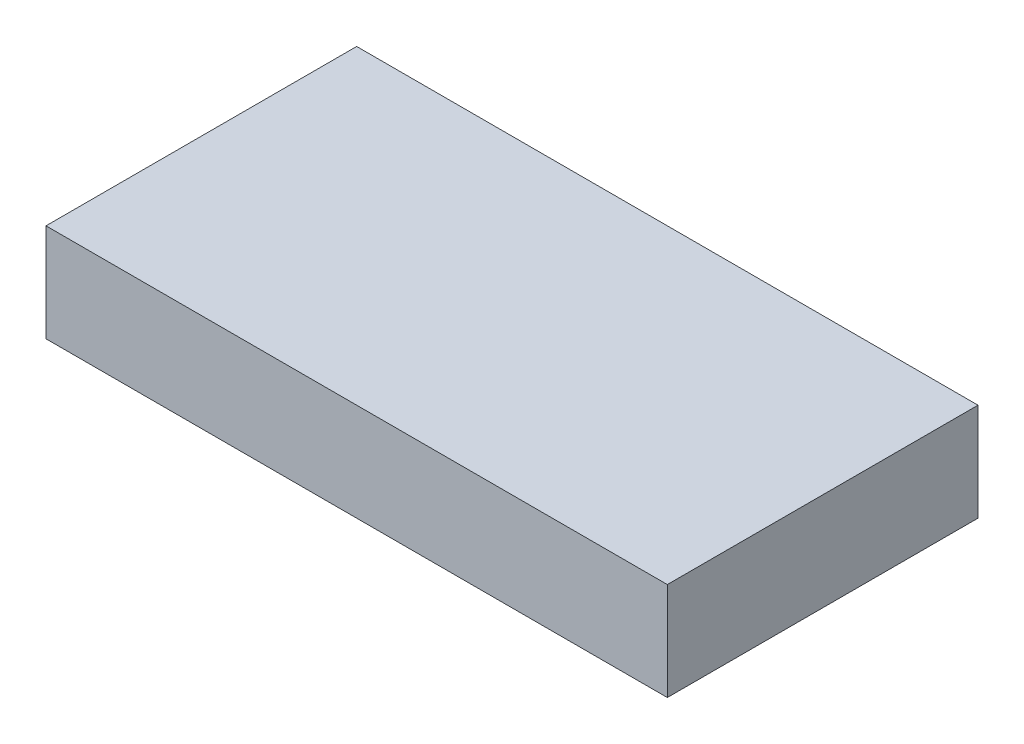
ISO-10303-21;
HEADER;
FILE_DESCRIPTION(('STEP AP214'),'2;1');
FILE_NAME('part.step','',(''),(''),'','','');
FILE_SCHEMA(('AUTOMOTIVE_DESIGN { 1 0 10303 214 1 1 1 1 }'));
ENDSEC;
DATA;
#1=APPLICATION_CONTEXT('core data for automotive mechanical design processes');
#2=APPLICATION_PROTOCOL_DEFINITION('international standard','automotive_design',2000,#1);
#3=PRODUCT_CONTEXT('',#1,'mechanical');
#4=PRODUCT('Part','Part','',(#3));
#5=PRODUCT_RELATED_PRODUCT_CATEGORY('part','',(#4));
#6=PRODUCT_DEFINITION_FORMATION('','',#4);
#7=PRODUCT_DEFINITION_CONTEXT('part definition',#1,'design');
#8=PRODUCT_DEFINITION('design','',#6,#7);
#9=PRODUCT_DEFINITION_SHAPE('','',#8);
#10=(LENGTH_UNIT() NAMED_UNIT(*) SI_UNIT(.MILLI.,.METRE.));
#11=(NAMED_UNIT(*) PLANE_ANGLE_UNIT() SI_UNIT($,.RADIAN.));
#12=(NAMED_UNIT(*) SI_UNIT($,.STERADIAN.) SOLID_ANGLE_UNIT());
#13=UNCERTAINTY_MEASURE_WITH_UNIT(LENGTH_MEASURE(1.E-05),#10,'distance_accuracy_value','');
#14=(GEOMETRIC_REPRESENTATION_CONTEXT(3) GLOBAL_UNCERTAINTY_ASSIGNED_CONTEXT((#13)) GLOBAL_UNIT_ASSIGNED_CONTEXT((#10,
#11,#12)) REPRESENTATION_CONTEXT('',''));
#15=CARTESIAN_POINT('',(0.,0.,0.));
#16=DIRECTION('',(0.,0.,1.));
#17=DIRECTION('',(1.,0.,0.));
#18=AXIS2_PLACEMENT_3D('',#15,#16,#17);
#19=CARTESIAN_POINT('',(0.,6.3,0.));
#20=DIRECTION('',(1.,0.,0.));
#21=DIRECTION('',(0.,0.,-1.));
#22=AXIS2_PLACEMENT_3D('',#19,#20,#21);
#23=PLANE('',#22);
#24=DIRECTION('',(0.,0.,1.));
#25=VECTOR('',#24,1.);
#26=CARTESIAN_POINT('',(0.,0.,0.));
#27=LINE('',#26,#25);
#28=CARTESIAN_POINT('',(0.,0.,-20.));
#29=VERTEX_POINT('',#28);
#30=CARTESIAN_POINT('',(0.,0.,0.));
#31=VERTEX_POINT('',#30);
#32=EDGE_CURVE('E106',#29,#31,#27,.T.);
#33=ORIENTED_EDGE('',*,*,#32,.T.);
#34=DIRECTION('',(0.,-1.,0.));
#35=VECTOR('',#34,1.);
#36=CARTESIAN_POINT('',(0.,6.3,0.));
#37=LINE('',#36,#35);
#38=CARTESIAN_POINT('',(0.,6.3,0.));
#39=VERTEX_POINT('',#38);
#40=EDGE_CURVE('E11',#39,#31,#37,.T.);
#41=ORIENTED_EDGE('',*,*,#40,.F.);
#42=DIRECTION('',(0.,0.,1.));
#43=VECTOR('',#42,1.);
#44=CARTESIAN_POINT('',(0.,6.3,0.));
#45=LINE('',#44,#43);
#46=CARTESIAN_POINT('',(0.,6.3,-20.));
#47=VERTEX_POINT('',#46);
#48=EDGE_CURVE('E92',#47,#39,#45,.T.);
#49=ORIENTED_EDGE('',*,*,#48,.F.);
#50=DIRECTION('',(0.,-1.,0.));
#51=VECTOR('',#50,1.);
#52=CARTESIAN_POINT('',(0.,6.3,-20.));
#53=LINE('',#52,#51);
#54=EDGE_CURVE('E105',#47,#29,#53,.T.);
#55=ORIENTED_EDGE('',*,*,#54,.T.);
#56=EDGE_LOOP('',(#33,#41,#49,#55));
#57=FACE_BOUND('',#56,.T.);
#58=ADVANCED_FACE('F43',(#57),#23,.F.);
#59=CARTESIAN_POINT('',(0.,6.3,0.));
#60=DIRECTION('',(0.,0.,-1.));
#61=DIRECTION('',(-1.,0.,0.));
#62=AXIS2_PLACEMENT_3D('',#59,#60,#61);
#63=PLANE('',#62);
#64=DIRECTION('',(1.,0.,0.));
#65=VECTOR('',#64,1.);
#66=CARTESIAN_POINT('',(0.,0.,0.));
#67=LINE('',#66,#65);
#68=CARTESIAN_POINT('',(40.,0.,0.));
#69=VERTEX_POINT('',#68);
#70=EDGE_CURVE('E97',#31,#69,#67,.T.);
#71=ORIENTED_EDGE('',*,*,#70,.T.);
#72=DIRECTION('',(0.,-1.,0.));
#73=VECTOR('',#72,1.);
#74=CARTESIAN_POINT('',(40.,6.3,0.));
#75=LINE('',#74,#73);
#76=CARTESIAN_POINT('',(40.,6.3,0.));
#77=VERTEX_POINT('',#76);
#78=EDGE_CURVE('E51',#77,#69,#75,.T.);
#79=ORIENTED_EDGE('',*,*,#78,.F.);
#80=DIRECTION('',(1.,0.,0.));
#81=VECTOR('',#80,1.);
#82=CARTESIAN_POINT('',(0.,6.3,0.));
#83=LINE('',#82,#81);
#84=EDGE_CURVE('E87',#39,#77,#83,.T.);
#85=ORIENTED_EDGE('',*,*,#84,.F.);
#86=ORIENTED_EDGE('',*,*,#40,.T.);
#87=EDGE_LOOP('',(#71,#79,#85,#86));
#88=FACE_BOUND('',#87,.T.);
#89=ADVANCED_FACE('F100',(#88),#63,.F.);
#90=CARTESIAN_POINT('',(40.,6.3,0.));
#91=DIRECTION('',(-1.,0.,0.));
#92=DIRECTION('',(0.,0.,1.));
#93=AXIS2_PLACEMENT_3D('',#90,#91,#92);
#94=PLANE('',#93);
#95=DIRECTION('',(0.,0.,-1.));
#96=VECTOR('',#95,1.);
#97=CARTESIAN_POINT('',(40.,0.,0.));
#98=LINE('',#97,#96);
#99=CARTESIAN_POINT('',(40.,0.,-20.));
#100=VERTEX_POINT('',#99);
#101=EDGE_CURVE('E78',#69,#100,#98,.T.);
#102=ORIENTED_EDGE('',*,*,#101,.T.);
#103=DIRECTION('',(0.,-1.,0.));
#104=VECTOR('',#103,1.);
#105=CARTESIAN_POINT('',(40.,6.3,-20.));
#106=LINE('',#105,#104);
#107=CARTESIAN_POINT('',(40.,6.3,-20.));
#108=VERTEX_POINT('',#107);
#109=EDGE_CURVE('E98',#108,#100,#106,.T.);
#110=ORIENTED_EDGE('',*,*,#109,.F.);
#111=DIRECTION('',(0.,0.,-1.));
#112=VECTOR('',#111,1.);
#113=CARTESIAN_POINT('',(40.,6.3,0.));
#114=LINE('',#113,#112);
#115=EDGE_CURVE('E95',#77,#108,#114,.T.);
#116=ORIENTED_EDGE('',*,*,#115,.F.);
#117=ORIENTED_EDGE('',*,*,#78,.T.);
#118=EDGE_LOOP('',(#102,#110,#116,#117));
#119=FACE_BOUND('',#118,.T.);
#120=ADVANCED_FACE('F99',(#119),#94,.F.);
#121=CARTESIAN_POINT('',(0.,6.3,-20.));
#122=DIRECTION('',(0.,0.,1.));
#123=DIRECTION('',(1.,0.,0.));
#124=AXIS2_PLACEMENT_3D('',#121,#122,#123);
#125=PLANE('',#124);
#126=DIRECTION('',(-1.,0.,0.));
#127=VECTOR('',#126,1.);
#128=CARTESIAN_POINT('',(0.,0.,-20.));
#129=LINE('',#128,#127);
#130=EDGE_CURVE('E85',#100,#29,#129,.T.);
#131=ORIENTED_EDGE('',*,*,#130,.T.);
#132=ORIENTED_EDGE('',*,*,#54,.F.);
#133=DIRECTION('',(-1.,0.,0.));
#134=VECTOR('',#133,1.);
#135=CARTESIAN_POINT('',(0.,6.3,-20.));
#136=LINE('',#135,#134);
#137=EDGE_CURVE('E56',#108,#47,#136,.T.);
#138=ORIENTED_EDGE('',*,*,#137,.F.);
#139=ORIENTED_EDGE('',*,*,#109,.T.);
#140=EDGE_LOOP('',(#131,#132,#138,#139));
#141=FACE_BOUND('',#140,.T.);
#142=ADVANCED_FACE('F111',(#141),#125,.F.);
#143=CARTESIAN_POINT('',(0.,6.3,0.));
#144=DIRECTION('',(0.,-1.,0.));
#145=DIRECTION('',(0.,0.,-1.));
#146=AXIS2_PLACEMENT_3D('',#143,#144,#145);
#147=PLANE('',#146);
#148=ORIENTED_EDGE('',*,*,#48,.T.);
#149=ORIENTED_EDGE('',*,*,#84,.T.);
#150=ORIENTED_EDGE('',*,*,#115,.T.);
#151=ORIENTED_EDGE('',*,*,#137,.T.);
#152=EDGE_LOOP('',(#148,#149,#150,#151));
#153=FACE_BOUND('',#152,.T.);
#154=ADVANCED_FACE('F89',(#153),#147,.F.);
#155=CARTESIAN_POINT('',(0.,0.,0.));
#156=DIRECTION('',(0.,-1.,0.));
#157=DIRECTION('',(0.,0.,-1.));
#158=AXIS2_PLACEMENT_3D('',#155,#156,#157);
#159=PLANE('',#158);
#160=ORIENTED_EDGE('',*,*,#32,.F.);
#161=ORIENTED_EDGE('',*,*,#130,.F.);
#162=ORIENTED_EDGE('',*,*,#101,.F.);
#163=ORIENTED_EDGE('',*,*,#70,.F.);
#164=EDGE_LOOP('',(#160,#161,#162,#163));
#165=FACE_BOUND('',#164,.T.);
#166=ADVANCED_FACE('F116',(#165),#159,.T.);
#167=CLOSED_SHELL('',(#58,#89,#120,#142,#154,#166));
#168=MANIFOLD_SOLID_BREP('B2',#167);
#169=ADVANCED_BREP_SHAPE_REPRESENTATION('',(#18,#168),#14);
#170=SHAPE_DEFINITION_REPRESENTATION(#9,#169);
ENDSEC;
END-ISO-10303-21;
